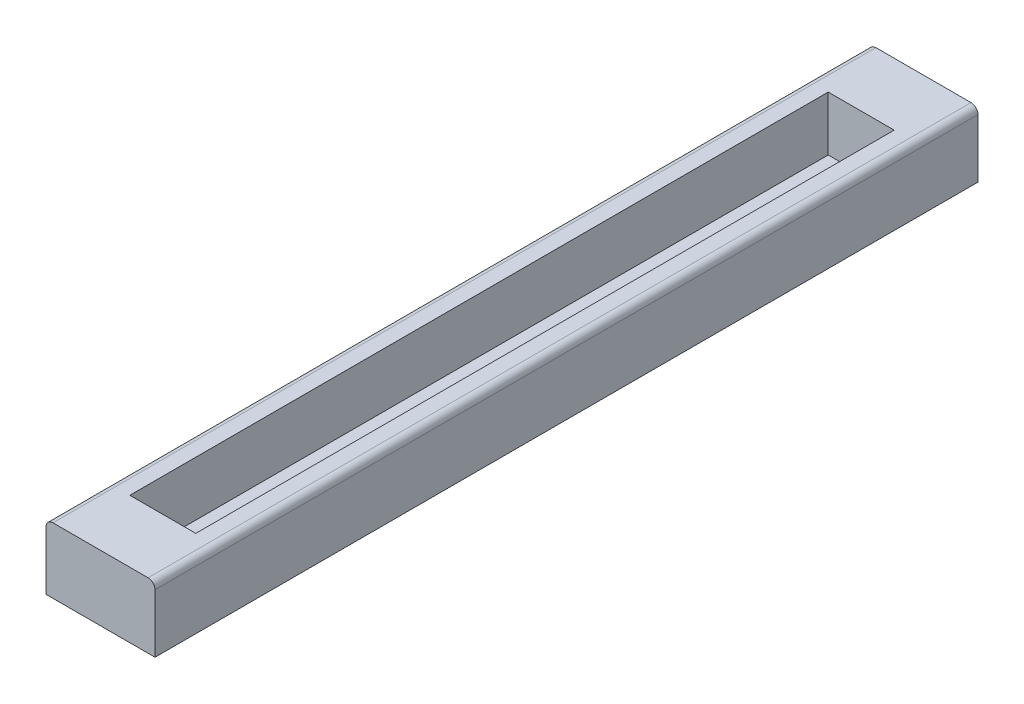
ISO-10303-21;
HEADER;
FILE_DESCRIPTION(('STEP AP214'),'2;1');
FILE_NAME('part.step','',(''),(''),'','','');
FILE_SCHEMA(('AUTOMOTIVE_DESIGN { 1 0 10303 214 1 1 1 1 }'));
ENDSEC;
DATA;
#1=APPLICATION_CONTEXT('core data for automotive mechanical design processes');
#2=APPLICATION_PROTOCOL_DEFINITION('international standard','automotive_design',2000,#1);
#3=PRODUCT_CONTEXT('',#1,'mechanical');
#4=PRODUCT('Part','Part','',(#3));
#5=PRODUCT_RELATED_PRODUCT_CATEGORY('part','',(#4));
#6=PRODUCT_DEFINITION_FORMATION('','',#4);
#7=PRODUCT_DEFINITION_CONTEXT('part definition',#1,'design');
#8=PRODUCT_DEFINITION('design','',#6,#7);
#9=PRODUCT_DEFINITION_SHAPE('','',#8);
#10=(LENGTH_UNIT() NAMED_UNIT(*) SI_UNIT(.MILLI.,.METRE.));
#11=(NAMED_UNIT(*) PLANE_ANGLE_UNIT() SI_UNIT($,.RADIAN.));
#12=(NAMED_UNIT(*) SI_UNIT($,.STERADIAN.) SOLID_ANGLE_UNIT());
#13=UNCERTAINTY_MEASURE_WITH_UNIT(LENGTH_MEASURE(1.E-05),#10,'distance_accuracy_value','');
#14=(GEOMETRIC_REPRESENTATION_CONTEXT(3) GLOBAL_UNCERTAINTY_ASSIGNED_CONTEXT((#13)) GLOBAL_UNIT_ASSIGNED_CONTEXT((#10,
#11,#12)) REPRESENTATION_CONTEXT('',''));
#15=CARTESIAN_POINT('',(0.,0.,0.));
#16=DIRECTION('',(0.,0.,1.));
#17=DIRECTION('',(1.,0.,0.));
#18=AXIS2_PLACEMENT_3D('',#15,#16,#17);
#19=CARTESIAN_POINT('',(1.,0.,7.55));
#20=DIRECTION('',(1.,0.,0.));
#21=DIRECTION('',(0.,0.,-1.));
#22=AXIS2_PLACEMENT_3D('',#19,#20,#21);
#23=PLANE('',#22);
#24=DIRECTION('',(0.,1.,0.));
#25=VECTOR('',#24,1.);
#26=CARTESIAN_POINT('',(1.,0.,-7.55));
#27=LINE('',#26,#25);
#28=CARTESIAN_POINT('',(1.,0.,-7.55));
#29=VERTEX_POINT('',#28);
#30=CARTESIAN_POINT('',(1.,1.073,-7.55));
#31=VERTEX_POINT('',#30);
#32=EDGE_CURVE('E165',#29,#31,#27,.T.);
#33=ORIENTED_EDGE('',*,*,#32,.T.);
#34=DIRECTION('',(0.,0.,-1.));
#35=VECTOR('',#34,1.);
#36=CARTESIAN_POINT('',(1.,1.073,7.55));
#37=LINE('',#36,#35);
#38=CARTESIAN_POINT('',(1.,1.073,7.55));
#39=VERTEX_POINT('',#38);
#40=EDGE_CURVE('E55',#31,#39,#37,.F.);
#41=ORIENTED_EDGE('',*,*,#40,.T.);
#42=DIRECTION('',(0.,1.,0.));
#43=VECTOR('',#42,1.);
#44=CARTESIAN_POINT('',(1.,0.,7.55));
#45=LINE('',#44,#43);
#46=CARTESIAN_POINT('',(1.,0.,7.55));
#47=VERTEX_POINT('',#46);
#48=EDGE_CURVE('E170',#47,#39,#45,.T.);
#49=ORIENTED_EDGE('',*,*,#48,.F.);
#50=DIRECTION('',(0.,0.,-1.));
#51=VECTOR('',#50,1.);
#52=CARTESIAN_POINT('',(1.,0.,7.55));
#53=LINE('',#52,#51);
#54=EDGE_CURVE('E152',#47,#29,#53,.T.);
#55=ORIENTED_EDGE('',*,*,#54,.T.);
#56=EDGE_LOOP('',(#33,#41,#49,#55));
#57=FACE_BOUND('',#56,.T.);
#58=ADVANCED_FACE('F32',(#57),#23,.T.);
#59=CARTESIAN_POINT('',(-1.,0.,7.55));
#60=DIRECTION('',(0.,0.,1.));
#61=DIRECTION('',(1.,0.,0.));
#62=AXIS2_PLACEMENT_3D('',#59,#60,#61);
#63=PLANE('',#62);
#64=ORIENTED_EDGE('',*,*,#48,.T.);
#65=CARTESIAN_POINT('',(0.873,1.073,7.55));
#66=DIRECTION('',(0.,0.,1.));
#67=DIRECTION('',(1.,0.,0.));
#68=AXIS2_PLACEMENT_3D('',#65,#66,#67);
#69=CIRCLE('',#68,0.127);
#70=CARTESIAN_POINT('',(0.873,1.2,7.55));
#71=VERTEX_POINT('',#70);
#72=EDGE_CURVE('E40',#39,#71,#69,.T.);
#73=ORIENTED_EDGE('',*,*,#72,.T.);
#74=DIRECTION('',(1.,0.,0.));
#75=VECTOR('',#74,1.);
#76=CARTESIAN_POINT('',(-1.,1.2,7.55));
#77=LINE('',#76,#75);
#78=CARTESIAN_POINT('',(-0.873,1.2,7.55));
#79=VERTEX_POINT('',#78);
#80=EDGE_CURVE('E156',#79,#71,#77,.T.);
#81=ORIENTED_EDGE('',*,*,#80,.F.);
#82=CARTESIAN_POINT('',(-0.873,1.073,7.55));
#83=DIRECTION('',(0.,0.,1.));
#84=DIRECTION('',(1.,0.,0.));
#85=AXIS2_PLACEMENT_3D('',#82,#83,#84);
#86=CIRCLE('',#85,0.127);
#87=CARTESIAN_POINT('',(-1.,1.073,7.55));
#88=VERTEX_POINT('',#87);
#89=EDGE_CURVE('E47',#79,#88,#86,.T.);
#90=ORIENTED_EDGE('',*,*,#89,.T.);
#91=DIRECTION('',(0.,1.,0.));
#92=VECTOR('',#91,1.);
#93=CARTESIAN_POINT('',(-1.,0.,7.55));
#94=LINE('',#93,#92);
#95=CARTESIAN_POINT('',(-1.,0.,7.55));
#96=VERTEX_POINT('',#95);
#97=EDGE_CURVE('E173',#96,#88,#94,.T.);
#98=ORIENTED_EDGE('',*,*,#97,.F.);
#99=DIRECTION('',(1.,0.,0.));
#100=VECTOR('',#99,1.);
#101=CARTESIAN_POINT('',(-1.,0.,7.55));
#102=LINE('',#101,#100);
#103=EDGE_CURVE('E162',#96,#47,#102,.T.);
#104=ORIENTED_EDGE('',*,*,#103,.T.);
#105=EDGE_LOOP('',(#64,#73,#81,#90,#98,#104));
#106=FACE_BOUND('',#105,.T.);
#107=ADVANCED_FACE('F190',(#106),#63,.T.);
#108=CARTESIAN_POINT('',(-1.,0.,-7.55));
#109=DIRECTION('',(-1.,0.,0.));
#110=DIRECTION('',(0.,0.,1.));
#111=AXIS2_PLACEMENT_3D('',#108,#109,#110);
#112=PLANE('',#111);
#113=ORIENTED_EDGE('',*,*,#97,.T.);
#114=DIRECTION('',(0.,0.,1.));
#115=VECTOR('',#114,1.);
#116=CARTESIAN_POINT('',(-1.,1.073,-7.55));
#117=LINE('',#116,#115);
#118=CARTESIAN_POINT('',(-1.,1.073,-7.55));
#119=VERTEX_POINT('',#118);
#120=EDGE_CURVE('E11',#88,#119,#117,.F.);
#121=ORIENTED_EDGE('',*,*,#120,.T.);
#122=DIRECTION('',(0.,1.,0.));
#123=VECTOR('',#122,1.);
#124=CARTESIAN_POINT('',(-1.,0.,-7.55));
#125=LINE('',#124,#123);
#126=CARTESIAN_POINT('',(-1.,0.,-7.55));
#127=VERTEX_POINT('',#126);
#128=EDGE_CURVE('E175',#127,#119,#125,.T.);
#129=ORIENTED_EDGE('',*,*,#128,.F.);
#130=DIRECTION('',(0.,0.,1.));
#131=VECTOR('',#130,1.);
#132=CARTESIAN_POINT('',(-1.,0.,-7.55));
#133=LINE('',#132,#131);
#134=EDGE_CURVE('E159',#127,#96,#133,.T.);
#135=ORIENTED_EDGE('',*,*,#134,.T.);
#136=EDGE_LOOP('',(#113,#121,#129,#135));
#137=FACE_BOUND('',#136,.T.);
#138=ADVANCED_FACE('F208',(#137),#112,.T.);
#139=CARTESIAN_POINT('',(1.,0.,-7.55));
#140=DIRECTION('',(0.,0.,-1.));
#141=DIRECTION('',(-1.,0.,0.));
#142=AXIS2_PLACEMENT_3D('',#139,#140,#141);
#143=PLANE('',#142);
#144=DIRECTION('',(-1.,0.,0.));
#145=VECTOR('',#144,1.);
#146=CARTESIAN_POINT('',(1.,1.2,-7.55));
#147=LINE('',#146,#145);
#148=CARTESIAN_POINT('',(0.873,1.2,-7.55));
#149=VERTEX_POINT('',#148);
#150=CARTESIAN_POINT('',(-0.873,1.2,-7.55));
#151=VERTEX_POINT('',#150);
#152=EDGE_CURVE('E148',#149,#151,#147,.T.);
#153=ORIENTED_EDGE('',*,*,#152,.F.);
#154=CARTESIAN_POINT('',(0.873,1.073,-7.55));
#155=DIRECTION('',(0.,0.,-1.));
#156=DIRECTION('',(-1.,0.,0.));
#157=AXIS2_PLACEMENT_3D('',#154,#155,#156);
#158=CIRCLE('',#157,0.127);
#159=EDGE_CURVE('E186',#149,#31,#158,.T.);
#160=ORIENTED_EDGE('',*,*,#159,.T.);
#161=ORIENTED_EDGE('',*,*,#32,.F.);
#162=DIRECTION('',(-1.,0.,0.));
#163=VECTOR('',#162,1.);
#164=CARTESIAN_POINT('',(1.,0.,-7.55));
#165=LINE('',#164,#163);
#166=EDGE_CURVE('E155',#29,#127,#165,.T.);
#167=ORIENTED_EDGE('',*,*,#166,.T.);
#168=ORIENTED_EDGE('',*,*,#128,.T.);
#169=CARTESIAN_POINT('',(-0.873,1.073,-7.55));
#170=DIRECTION('',(0.,0.,-1.));
#171=DIRECTION('',(-1.,0.,0.));
#172=AXIS2_PLACEMENT_3D('',#169,#170,#171);
#173=CIRCLE('',#172,0.127);
#174=EDGE_CURVE('E184',#119,#151,#173,.T.);
#175=ORIENTED_EDGE('',*,*,#174,.T.);
#176=EDGE_LOOP('',(#153,#160,#161,#167,#168,#175));
#177=FACE_BOUND('',#176,.T.);
#178=ADVANCED_FACE('F199',(#177),#143,.T.);
#179=CARTESIAN_POINT('',(1.,0.,-7.55));
#180=DIRECTION('',(0.,1.,0.));
#181=DIRECTION('',(0.,0.,1.));
#182=AXIS2_PLACEMENT_3D('',#179,#180,#181);
#183=PLANE('',#182);
#184=ORIENTED_EDGE('',*,*,#54,.F.);
#185=ORIENTED_EDGE('',*,*,#103,.F.);
#186=ORIENTED_EDGE('',*,*,#134,.F.);
#187=ORIENTED_EDGE('',*,*,#166,.F.);
#188=EDGE_LOOP('',(#184,#185,#186,#187));
#189=FACE_BOUND('',#188,.T.);
#190=ADVANCED_FACE('F204',(#189),#183,.F.);
#191=CARTESIAN_POINT('',(1.,1.2,-7.55));
#192=DIRECTION('',(0.,1.,0.));
#193=DIRECTION('',(0.,0.,1.));
#194=AXIS2_PLACEMENT_3D('',#191,#192,#193);
#195=PLANE('',#194);
#196=DIRECTION('',(0.,0.,-1.));
#197=VECTOR('',#196,1.);
#198=CARTESIAN_POINT('',(0.605000000000002,1.2,6.407));
#199=LINE('',#198,#197);
#200=CARTESIAN_POINT('',(0.605000000000002,1.2,6.407));
#201=VERTEX_POINT('',#200);
#202=CARTESIAN_POINT('',(0.605000000000004,1.2,-6.407));
#203=VERTEX_POINT('',#202);
#204=EDGE_CURVE('E116',#201,#203,#199,.T.);
#205=ORIENTED_EDGE('',*,*,#204,.F.);
#206=DIRECTION('',(1.,0.,0.));
#207=VECTOR('',#206,1.);
#208=CARTESIAN_POINT('',(-0.604999999999998,1.2,6.407));
#209=LINE('',#208,#207);
#210=CARTESIAN_POINT('',(-0.604999999999998,1.2,6.407));
#211=VERTEX_POINT('',#210);
#212=EDGE_CURVE('E133',#211,#201,#209,.T.);
#213=ORIENTED_EDGE('',*,*,#212,.F.);
#214=DIRECTION('',(0.,0.,1.));
#215=VECTOR('',#214,1.);
#216=CARTESIAN_POINT('',(-0.604999999999998,1.2,-6.407));
#217=LINE('',#216,#215);
#218=CARTESIAN_POINT('',(-0.604999999999998,1.2,-6.407));
#219=VERTEX_POINT('',#218);
#220=EDGE_CURVE('E136',#219,#211,#217,.T.);
#221=ORIENTED_EDGE('',*,*,#220,.F.);
#222=DIRECTION('',(-1.,0.,0.));
#223=VECTOR('',#222,1.);
#224=CARTESIAN_POINT('',(0.605000000000002,1.2,-6.407));
#225=LINE('',#224,#223);
#226=EDGE_CURVE('E142',#203,#219,#225,.T.);
#227=ORIENTED_EDGE('',*,*,#226,.F.);
#228=EDGE_LOOP('',(#205,#213,#221,#227));
#229=FACE_BOUND('',#228,.T.);
#230=ORIENTED_EDGE('',*,*,#80,.T.);
#231=DIRECTION('',(0.,0.,-1.));
#232=VECTOR('',#231,1.);
#233=CARTESIAN_POINT('',(0.873,1.2,-7.55));
#234=LINE('',#233,#232);
#235=EDGE_CURVE('E181',#71,#149,#234,.T.);
#236=ORIENTED_EDGE('',*,*,#235,.T.);
#237=ORIENTED_EDGE('',*,*,#152,.T.);
#238=DIRECTION('',(0.,0.,1.));
#239=VECTOR('',#238,1.);
#240=CARTESIAN_POINT('',(-0.873,1.2,-7.55));
#241=LINE('',#240,#239);
#242=EDGE_CURVE('E172',#151,#79,#241,.T.);
#243=ORIENTED_EDGE('',*,*,#242,.T.);
#244=EDGE_LOOP('',(#230,#236,#237,#243));
#245=FACE_BOUND('',#244,.T.);
#246=ADVANCED_FACE('F194',(#229,#245),#195,.T.);
#247=CARTESIAN_POINT('',(0.605000000000003,0.2,6.407));
#248=DIRECTION('',(1.,0.,0.));
#249=DIRECTION('',(0.,1.,0.));
#250=AXIS2_PLACEMENT_3D('',#247,#248,#249);
#251=PLANE('',#250);
#252=ORIENTED_EDGE('',*,*,#204,.T.);
#253=DIRECTION('',(0.,1.,0.));
#254=VECTOR('',#253,1.);
#255=CARTESIAN_POINT('',(0.605000000000003,0.2,-6.407));
#256=LINE('',#255,#254);
#257=CARTESIAN_POINT('',(0.605000000000003,0.2,-6.407));
#258=VERTEX_POINT('',#257);
#259=EDGE_CURVE('E109',#258,#203,#256,.T.);
#260=ORIENTED_EDGE('',*,*,#259,.F.);
#261=DIRECTION('',(0.,0.,-1.));
#262=VECTOR('',#261,1.);
#263=CARTESIAN_POINT('',(0.605000000000003,0.2,6.407));
#264=LINE('',#263,#262);
#265=CARTESIAN_POINT('',(0.605000000000003,0.2,6.407));
#266=VERTEX_POINT('',#265);
#267=EDGE_CURVE('E113',#266,#258,#264,.T.);
#268=ORIENTED_EDGE('',*,*,#267,.F.);
#269=DIRECTION('',(0.,1.,0.));
#270=VECTOR('',#269,1.);
#271=CARTESIAN_POINT('',(0.605000000000003,0.2,6.407));
#272=LINE('',#271,#270);
#273=EDGE_CURVE('E146',#266,#201,#272,.T.);
#274=ORIENTED_EDGE('',*,*,#273,.T.);
#275=EDGE_LOOP('',(#252,#260,#268,#274));
#276=FACE_BOUND('',#275,.T.);
#277=ADVANCED_FACE('F111',(#276),#251,.F.);
#278=CARTESIAN_POINT('',(-0.604999999999996,0.199999999999998,6.407));
#279=DIRECTION('',(0.,0.,1.));
#280=DIRECTION('',(0.,-1.,0.));
#281=AXIS2_PLACEMENT_3D('',#278,#279,#280);
#282=PLANE('',#281);
#283=ORIENTED_EDGE('',*,*,#212,.T.);
#284=ORIENTED_EDGE('',*,*,#273,.F.);
#285=DIRECTION('',(1.,0.,0.));
#286=VECTOR('',#285,1.);
#287=CARTESIAN_POINT('',(-0.604999999999996,0.199999999999998,6.407));
#288=LINE('',#287,#286);
#289=CARTESIAN_POINT('',(-0.604999999999996,0.199999999999998,6.407));
#290=VERTEX_POINT('',#289);
#291=EDGE_CURVE('E121',#290,#266,#288,.T.);
#292=ORIENTED_EDGE('',*,*,#291,.F.);
#293=DIRECTION('',(0.,1.,0.));
#294=VECTOR('',#293,1.);
#295=CARTESIAN_POINT('',(-0.604999999999996,0.199999999999998,6.407));
#296=LINE('',#295,#294);
#297=EDGE_CURVE('E149',#290,#211,#296,.T.);
#298=ORIENTED_EDGE('',*,*,#297,.T.);
#299=EDGE_LOOP('',(#283,#284,#292,#298));
#300=FACE_BOUND('',#299,.T.);
#301=ADVANCED_FACE('F233',(#300),#282,.F.);
#302=CARTESIAN_POINT('',(-0.604999999999996,0.199999999999998,-6.407));
#303=DIRECTION('',(-1.,0.,0.));
#304=DIRECTION('',(0.,-1.,0.));
#305=AXIS2_PLACEMENT_3D('',#302,#303,#304);
#306=PLANE('',#305);
#307=ORIENTED_EDGE('',*,*,#220,.T.);
#308=ORIENTED_EDGE('',*,*,#297,.F.);
#309=DIRECTION('',(0.,0.,1.));
#310=VECTOR('',#309,1.);
#311=CARTESIAN_POINT('',(-0.604999999999996,0.199999999999998,-6.407));
#312=LINE('',#311,#310);
#313=CARTESIAN_POINT('',(-0.604999999999996,0.199999999999998,-6.407));
#314=VERTEX_POINT('',#313);
#315=EDGE_CURVE('E129',#314,#290,#312,.T.);
#316=ORIENTED_EDGE('',*,*,#315,.F.);
#317=DIRECTION('',(0.,1.,0.));
#318=VECTOR('',#317,1.);
#319=CARTESIAN_POINT('',(-0.604999999999996,0.199999999999998,-6.407));
#320=LINE('',#319,#318);
#321=EDGE_CURVE('E120',#314,#219,#320,.T.);
#322=ORIENTED_EDGE('',*,*,#321,.T.);
#323=EDGE_LOOP('',(#307,#308,#316,#322));
#324=FACE_BOUND('',#323,.T.);
#325=ADVANCED_FACE('F236',(#324),#306,.F.);
#326=CARTESIAN_POINT('',(0.605000000000003,0.2,-6.407));
#327=DIRECTION('',(0.,0.,-1.));
#328=DIRECTION('',(0.,1.,0.));
#329=AXIS2_PLACEMENT_3D('',#326,#327,#328);
#330=PLANE('',#329);
#331=ORIENTED_EDGE('',*,*,#226,.T.);
#332=ORIENTED_EDGE('',*,*,#321,.F.);
#333=DIRECTION('',(-1.,0.,0.));
#334=VECTOR('',#333,1.);
#335=CARTESIAN_POINT('',(0.605000000000003,0.2,-6.407));
#336=LINE('',#335,#334);
#337=EDGE_CURVE('E124',#258,#314,#336,.T.);
#338=ORIENTED_EDGE('',*,*,#337,.F.);
#339=ORIENTED_EDGE('',*,*,#259,.T.);
#340=EDGE_LOOP('',(#331,#332,#338,#339));
#341=FACE_BOUND('',#340,.T.);
#342=ADVANCED_FACE('F125',(#341),#330,.F.);
#343=CARTESIAN_POINT('',(0.605000000000003,0.2,-6.407));
#344=DIRECTION('',(0.,1.,0.));
#345=DIRECTION('',(-1.,0.,0.));
#346=AXIS2_PLACEMENT_3D('',#343,#344,#345);
#347=PLANE('',#346);
#348=ORIENTED_EDGE('',*,*,#267,.T.);
#349=ORIENTED_EDGE('',*,*,#337,.T.);
#350=ORIENTED_EDGE('',*,*,#315,.T.);
#351=ORIENTED_EDGE('',*,*,#291,.T.);
#352=EDGE_LOOP('',(#348,#349,#350,#351));
#353=FACE_BOUND('',#352,.T.);
#354=ADVANCED_FACE('F131',(#353),#347,.T.);
#355=CARTESIAN_POINT('',(0.873,1.073,-7.55));
#356=DIRECTION('',(0.,0.,-1.));
#357=DIRECTION('',(-1.,0.,0.));
#358=AXIS2_PLACEMENT_3D('',#355,#356,#357);
#359=CYLINDRICAL_SURFACE('',#358,0.127);
#360=ORIENTED_EDGE('',*,*,#72,.F.);
#361=ORIENTED_EDGE('',*,*,#40,.F.);
#362=ORIENTED_EDGE('',*,*,#159,.F.);
#363=ORIENTED_EDGE('',*,*,#235,.F.);
#364=EDGE_LOOP('',(#360,#361,#362,#363));
#365=FACE_BOUND('',#364,.T.);
#366=ADVANCED_FACE('F197',(#365),#359,.T.);
#367=CARTESIAN_POINT('',(-0.873,1.073,-7.55));
#368=DIRECTION('',(0.,0.,1.));
#369=DIRECTION('',(1.,0.,0.));
#370=AXIS2_PLACEMENT_3D('',#367,#368,#369);
#371=CYLINDRICAL_SURFACE('',#370,0.127);
#372=ORIENTED_EDGE('',*,*,#174,.F.);
#373=ORIENTED_EDGE('',*,*,#120,.F.);
#374=ORIENTED_EDGE('',*,*,#89,.F.);
#375=ORIENTED_EDGE('',*,*,#242,.F.);
#376=EDGE_LOOP('',(#372,#373,#374,#375));
#377=FACE_BOUND('',#376,.T.);
#378=ADVANCED_FACE('F34',(#377),#371,.T.);
#379=CLOSED_SHELL('',(#58,#107,#138,#178,#190,#246,#277,#301,#325,#342,#354,#366,#378));
#380=MANIFOLD_SOLID_BREP('B2',#379);
#381=ADVANCED_BREP_SHAPE_REPRESENTATION('',(#18,#380),#14);
#382=SHAPE_DEFINITION_REPRESENTATION(#9,#381);
ENDSEC;
END-ISO-10303-21;
